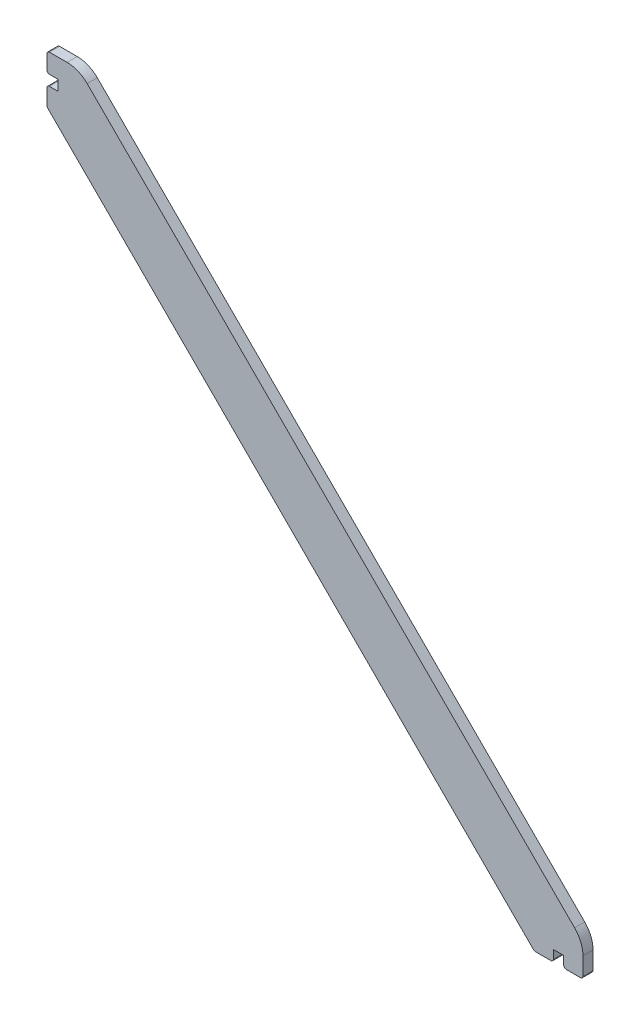
ISO-10303-21;
HEADER;
FILE_DESCRIPTION(('STEP AP214'),'2;1');
FILE_NAME('part.step','',(''),(''),'','','');
FILE_SCHEMA(('AUTOMOTIVE_DESIGN { 1 0 10303 214 1 1 1 1 }'));
ENDSEC;
DATA;
#1=APPLICATION_CONTEXT('core data for automotive mechanical design processes');
#2=APPLICATION_PROTOCOL_DEFINITION('international standard','automotive_design',2000,#1);
#3=PRODUCT_CONTEXT('',#1,'mechanical');
#4=PRODUCT('Part','Part','',(#3));
#5=PRODUCT_RELATED_PRODUCT_CATEGORY('part','',(#4));
#6=PRODUCT_DEFINITION_FORMATION('','',#4);
#7=PRODUCT_DEFINITION_CONTEXT('part definition',#1,'design');
#8=PRODUCT_DEFINITION('design','',#6,#7);
#9=PRODUCT_DEFINITION_SHAPE('','',#8);
#10=(LENGTH_UNIT() NAMED_UNIT(*) SI_UNIT(.MILLI.,.METRE.));
#11=(NAMED_UNIT(*) PLANE_ANGLE_UNIT() SI_UNIT($,.RADIAN.));
#12=(NAMED_UNIT(*) SI_UNIT($,.STERADIAN.) SOLID_ANGLE_UNIT());
#13=UNCERTAINTY_MEASURE_WITH_UNIT(LENGTH_MEASURE(1.E-05),#10,'distance_accuracy_value','');
#14=(GEOMETRIC_REPRESENTATION_CONTEXT(3) GLOBAL_UNCERTAINTY_ASSIGNED_CONTEXT((#13)) GLOBAL_UNIT_ASSIGNED_CONTEXT((#10,
#11,#12)) REPRESENTATION_CONTEXT('',''));
#15=CARTESIAN_POINT('',(0.,0.,0.));
#16=DIRECTION('',(0.,0.,1.));
#17=DIRECTION('',(1.,0.,0.));
#18=AXIS2_PLACEMENT_3D('',#15,#16,#17);
#19=CARTESIAN_POINT('',(-100.,100.,4.));
#20=DIRECTION('',(1.,0.,0.));
#21=DIRECTION('',(0.,0.,-1.));
#22=AXIS2_PLACEMENT_3D('',#19,#20,#21);
#23=PLANE('',#22);
#24=DIRECTION('',(0.,-1.,0.));
#25=VECTOR('',#24,1.);
#26=CARTESIAN_POINT('',(-100.,100.,0.));
#27=LINE('',#26,#25);
#28=CARTESIAN_POINT('',(-100.,100.,0.));
#29=VERTEX_POINT('',#28);
#30=CARTESIAN_POINT('',(-100.,95.8999999999999,0.));
#31=VERTEX_POINT('',#30);
#32=EDGE_CURVE('E225',#29,#31,#27,.T.);
#33=ORIENTED_EDGE('',*,*,#32,.T.);
#34=DIRECTION('',(0.,0.,-1.));
#35=VECTOR('',#34,1.);
#36=CARTESIAN_POINT('',(-100.,95.8999999999999,4.));
#37=LINE('',#36,#35);
#38=CARTESIAN_POINT('',(-100.,95.8999999999999,4.));
#39=VERTEX_POINT('',#38);
#40=EDGE_CURVE('E11',#39,#31,#37,.T.);
#41=ORIENTED_EDGE('',*,*,#40,.F.);
#42=DIRECTION('',(0.,-1.,0.));
#43=VECTOR('',#42,1.);
#44=CARTESIAN_POINT('',(-100.,100.,4.));
#45=LINE('',#44,#43);
#46=CARTESIAN_POINT('',(-100.,100.,4.));
#47=VERTEX_POINT('',#46);
#48=EDGE_CURVE('E273',#47,#39,#45,.T.);
#49=ORIENTED_EDGE('',*,*,#48,.F.);
#50=DIRECTION('',(0.,0.,-1.));
#51=VECTOR('',#50,1.);
#52=CARTESIAN_POINT('',(-100.,100.,4.));
#53=LINE('',#52,#51);
#54=EDGE_CURVE('E221',#47,#29,#53,.T.);
#55=ORIENTED_EDGE('',*,*,#54,.T.);
#56=EDGE_LOOP('',(#33,#41,#49,#55));
#57=FACE_BOUND('',#56,.T.);
#58=ADVANCED_FACE('F33',(#57),#23,.F.);
#59=CARTESIAN_POINT('',(-100.,95.8999999999999,4.));
#60=DIRECTION('',(0.,-1.,0.));
#61=DIRECTION('',(0.,0.,-1.));
#62=AXIS2_PLACEMENT_3D('',#59,#60,#61);
#63=PLANE('',#62);
#64=DIRECTION('',(-1.,0.,0.));
#65=VECTOR('',#64,1.);
#66=CARTESIAN_POINT('',(-100.,95.8999999999999,0.));
#67=LINE('',#66,#65);
#68=CARTESIAN_POINT('',(-103.304951288349,95.8999999999999,0.));
#69=VERTEX_POINT('',#68);
#70=EDGE_CURVE('E228',#31,#69,#67,.T.);
#71=ORIENTED_EDGE('',*,*,#70,.T.);
#72=DIRECTION('',(0.,0.,-1.));
#73=VECTOR('',#72,1.);
#74=CARTESIAN_POINT('',(-103.304951288349,95.8999999999999,4.));
#75=LINE('',#74,#73);
#76=CARTESIAN_POINT('',(-103.304951288349,95.8999999999999,4.));
#77=VERTEX_POINT('',#76);
#78=EDGE_CURVE('E41',#77,#69,#75,.T.);
#79=ORIENTED_EDGE('',*,*,#78,.F.);
#80=DIRECTION('',(-1.,0.,0.));
#81=VECTOR('',#80,1.);
#82=CARTESIAN_POINT('',(-100.,95.8999999999999,4.));
#83=LINE('',#82,#81);
#84=EDGE_CURVE('E140',#39,#77,#83,.T.);
#85=ORIENTED_EDGE('',*,*,#84,.F.);
#86=ORIENTED_EDGE('',*,*,#40,.T.);
#87=EDGE_LOOP('',(#71,#79,#85,#86));
#88=FACE_BOUND('',#87,.T.);
#89=ADVANCED_FACE('F410',(#88),#63,.F.);
#90=CARTESIAN_POINT('',(-103.304951288349,94.8999999999999,4.));
#91=DIRECTION('',(0.,0.,-1.));
#92=DIRECTION('',(-1.,0.,0.));
#93=AXIS2_PLACEMENT_3D('',#90,#91,#92);
#94=CYLINDRICAL_SURFACE('',#93,1.);
#95=CARTESIAN_POINT('',(-103.304951288349,94.8999999999999,0.));
#96=DIRECTION('',(0.,0.,1.));
#97=DIRECTION('',(1.,0.,0.));
#98=AXIS2_PLACEMENT_3D('',#95,#96,#97);
#99=CIRCLE('',#98,1.);
#100=CARTESIAN_POINT('',(-104.304951288349,94.8999999999999,0.));
#101=VERTEX_POINT('',#100);
#102=EDGE_CURVE('E230',#69,#101,#99,.T.);
#103=ORIENTED_EDGE('',*,*,#102,.T.);
#104=DIRECTION('',(0.,0.,-1.));
#105=VECTOR('',#104,1.);
#106=CARTESIAN_POINT('',(-104.304951288349,94.8999999999999,4.));
#107=LINE('',#106,#105);
#108=CARTESIAN_POINT('',(-104.304951288349,94.8999999999999,4.));
#109=VERTEX_POINT('',#108);
#110=EDGE_CURVE('E328',#109,#101,#107,.T.);
#111=ORIENTED_EDGE('',*,*,#110,.F.);
#112=CARTESIAN_POINT('',(-103.304951288349,94.8999999999999,4.));
#113=DIRECTION('',(0.,0.,1.));
#114=DIRECTION('',(1.,0.,0.));
#115=AXIS2_PLACEMENT_3D('',#112,#113,#114);
#116=CIRCLE('',#115,1.);
#117=EDGE_CURVE('E336',#77,#109,#116,.T.);
#118=ORIENTED_EDGE('',*,*,#117,.F.);
#119=ORIENTED_EDGE('',*,*,#78,.T.);
#120=EDGE_LOOP('',(#103,#111,#118,#119));
#121=FACE_BOUND('',#120,.T.);
#122=ADVANCED_FACE('F334',(#121),#94,.T.);
#123=CARTESIAN_POINT('',(-104.304951288349,94.8999999999999,4.));
#124=DIRECTION('',(1.,0.,0.));
#125=DIRECTION('',(0.,0.,-1.));
#126=AXIS2_PLACEMENT_3D('',#123,#124,#125);
#127=PLANE('',#126);
#128=DIRECTION('',(0.,-1.,0.));
#129=VECTOR('',#128,1.);
#130=CARTESIAN_POINT('',(-104.304951288349,94.8999999999999,0.));
#131=LINE('',#130,#129);
#132=CARTESIAN_POINT('',(-104.304951288349,88.8092622740246,0.));
#133=VERTEX_POINT('',#132);
#134=EDGE_CURVE('E232',#101,#133,#131,.T.);
#135=ORIENTED_EDGE('',*,*,#134,.T.);
#136=DIRECTION('',(0.,0.,-1.));
#137=VECTOR('',#136,1.);
#138=CARTESIAN_POINT('',(-104.304951288349,88.8092622740246,4.));
#139=LINE('',#138,#137);
#140=CARTESIAN_POINT('',(-104.304951288349,88.8092622740246,4.));
#141=VERTEX_POINT('',#140);
#142=EDGE_CURVE('E325',#141,#133,#139,.T.);
#143=ORIENTED_EDGE('',*,*,#142,.F.);
#144=DIRECTION('',(0.,-1.,0.));
#145=VECTOR('',#144,1.);
#146=CARTESIAN_POINT('',(-104.304951288349,94.8999999999999,4.));
#147=LINE('',#146,#145);
#148=EDGE_CURVE('E353',#109,#141,#147,.T.);
#149=ORIENTED_EDGE('',*,*,#148,.F.);
#150=ORIENTED_EDGE('',*,*,#110,.T.);
#151=EDGE_LOOP('',(#135,#143,#149,#150));
#152=FACE_BOUND('',#151,.T.);
#153=ADVANCED_FACE('F344',(#152),#127,.F.);
#154=CARTESIAN_POINT('',(-103.304951288349,88.8092622740246,4.));
#155=DIRECTION('',(0.,0.,-1.));
#156=DIRECTION('',(-1.,0.,0.));
#157=AXIS2_PLACEMENT_3D('',#154,#155,#156);
#158=CYLINDRICAL_SURFACE('',#157,1.00000000000006);
#159=CARTESIAN_POINT('',(-103.304951288349,88.8092622740246,0.));
#160=DIRECTION('',(0.,0.,1.));
#161=DIRECTION('',(1.,0.,0.));
#162=AXIS2_PLACEMENT_3D('',#159,#160,#161);
#163=CIRCLE('',#162,1.00000000000006);
#164=CARTESIAN_POINT('',(-104.012058069535,88.102155492838,0.));
#165=VERTEX_POINT('',#164);
#166=EDGE_CURVE('E234',#133,#165,#163,.T.);
#167=ORIENTED_EDGE('',*,*,#166,.T.);
#168=DIRECTION('',(0.,0.,-1.));
#169=VECTOR('',#168,1.);
#170=CARTESIAN_POINT('',(-104.012058069535,88.102155492838,4.));
#171=LINE('',#170,#169);
#172=CARTESIAN_POINT('',(-104.012058069535,88.102155492838,4.));
#173=VERTEX_POINT('',#172);
#174=EDGE_CURVE('E322',#173,#165,#171,.T.);
#175=ORIENTED_EDGE('',*,*,#174,.F.);
#176=CARTESIAN_POINT('',(-103.304951288349,88.8092622740246,4.));
#177=DIRECTION('',(0.,0.,1.));
#178=DIRECTION('',(1.,0.,0.));
#179=AXIS2_PLACEMENT_3D('',#176,#177,#178);
#180=CIRCLE('',#179,1.00000000000006);
#181=EDGE_CURVE('E350',#141,#173,#180,.T.);
#182=ORIENTED_EDGE('',*,*,#181,.F.);
#183=ORIENTED_EDGE('',*,*,#142,.T.);
#184=EDGE_LOOP('',(#167,#175,#182,#183));
#185=FACE_BOUND('',#184,.T.);
#186=ADVANCED_FACE('F348',(#185),#158,.T.);
#187=CARTESIAN_POINT('',(88.1021554928379,-104.012058069535,4.));
#188=DIRECTION('',(0.707106781186557,0.707106781186538,0.));
#189=DIRECTION('',(-0.707106781186538,0.707106781186557,0.));
#190=AXIS2_PLACEMENT_3D('',#187,#188,#189);
#191=PLANE('',#190);
#192=DIRECTION('',(0.707106781186538,-0.707106781186557,0.));
#193=VECTOR('',#192,1.);
#194=CARTESIAN_POINT('',(88.1021554928379,-104.012058069535,0.));
#195=LINE('',#194,#193);
#196=CARTESIAN_POINT('',(88.1021554928379,-104.012058069535,0.));
#197=VERTEX_POINT('',#196);
#198=EDGE_CURVE('E237',#165,#197,#195,.T.);
#199=ORIENTED_EDGE('',*,*,#198,.T.);
#200=DIRECTION('',(0.,0.,-1.));
#201=VECTOR('',#200,1.);
#202=CARTESIAN_POINT('',(88.1021554928379,-104.012058069535,4.));
#203=LINE('',#202,#201);
#204=CARTESIAN_POINT('',(88.1021554928379,-104.012058069535,4.));
#205=VERTEX_POINT('',#204);
#206=EDGE_CURVE('E319',#205,#197,#203,.T.);
#207=ORIENTED_EDGE('',*,*,#206,.F.);
#208=DIRECTION('',(0.707106781186557,-0.707106781186538,0.));
#209=VECTOR('',#208,1.);
#210=CARTESIAN_POINT('',(-104.012058069535,88.102155492838,4.));
#211=LINE('',#210,#209);
#212=EDGE_CURVE('E352',#173,#205,#211,.T.);
#213=ORIENTED_EDGE('',*,*,#212,.F.);
#214=ORIENTED_EDGE('',*,*,#174,.T.);
#215=EDGE_LOOP('',(#199,#207,#213,#214));
#216=FACE_BOUND('',#215,.T.);
#217=ADVANCED_FACE('F423',(#216),#191,.F.);
#218=CARTESIAN_POINT('',(88.8092622740244,-103.304951288348,4.));
#219=DIRECTION('',(0.,0.,-1.));
#220=DIRECTION('',(-1.,0.,0.));
#221=AXIS2_PLACEMENT_3D('',#218,#219,#220);
#222=CYLINDRICAL_SURFACE('',#221,1.00000000000011);
#223=CARTESIAN_POINT('',(88.8092622740244,-103.304951288348,0.));
#224=DIRECTION('',(0.,0.,1.));
#225=DIRECTION('',(-1.,0.,0.));
#226=AXIS2_PLACEMENT_3D('',#223,#224,#225);
#227=CIRCLE('',#226,1.00000000000011);
#228=CARTESIAN_POINT('',(88.8092622740245,-104.304951288349,0.));
#229=VERTEX_POINT('',#228);
#230=EDGE_CURVE('E239',#197,#229,#227,.T.);
#231=ORIENTED_EDGE('',*,*,#230,.T.);
#232=DIRECTION('',(0.,0.,-1.));
#233=VECTOR('',#232,1.);
#234=CARTESIAN_POINT('',(88.8092622740245,-104.304951288349,4.));
#235=LINE('',#234,#233);
#236=CARTESIAN_POINT('',(88.8092622740245,-104.304951288349,4.));
#237=VERTEX_POINT('',#236);
#238=EDGE_CURVE('E316',#237,#229,#235,.T.);
#239=ORIENTED_EDGE('',*,*,#238,.F.);
#240=CARTESIAN_POINT('',(88.8092622740244,-103.304951288348,4.));
#241=DIRECTION('',(0.,0.,1.));
#242=DIRECTION('',(-1.,0.,0.));
#243=AXIS2_PLACEMENT_3D('',#240,#241,#242);
#244=CIRCLE('',#243,1.00000000000011);
#245=EDGE_CURVE('E355',#205,#237,#244,.T.);
#246=ORIENTED_EDGE('',*,*,#245,.F.);
#247=ORIENTED_EDGE('',*,*,#206,.T.);
#248=EDGE_LOOP('',(#231,#239,#246,#247));
#249=FACE_BOUND('',#248,.T.);
#250=ADVANCED_FACE('F426',(#249),#222,.T.);
#251=CARTESIAN_POINT('',(94.8999999999999,-104.304951288349,4.));
#252=DIRECTION('',(0.,1.,0.));
#253=DIRECTION('',(0.,0.,1.));
#254=AXIS2_PLACEMENT_3D('',#251,#252,#253);
#255=PLANE('',#254);
#256=DIRECTION('',(1.,0.,0.));
#257=VECTOR('',#256,1.);
#258=CARTESIAN_POINT('',(94.8999999999999,-104.304951288349,0.));
#259=LINE('',#258,#257);
#260=CARTESIAN_POINT('',(94.8999999999999,-104.304951288349,0.));
#261=VERTEX_POINT('',#260);
#262=EDGE_CURVE('E241',#229,#261,#259,.T.);
#263=ORIENTED_EDGE('',*,*,#262,.T.);
#264=DIRECTION('',(0.,0.,-1.));
#265=VECTOR('',#264,1.);
#266=CARTESIAN_POINT('',(94.8999999999999,-104.304951288349,4.));
#267=LINE('',#266,#265);
#268=CARTESIAN_POINT('',(94.8999999999999,-104.304951288349,4.));
#269=VERTEX_POINT('',#268);
#270=EDGE_CURVE('E313',#269,#261,#267,.T.);
#271=ORIENTED_EDGE('',*,*,#270,.F.);
#272=DIRECTION('',(1.,0.,0.));
#273=VECTOR('',#272,1.);
#274=CARTESIAN_POINT('',(94.8999999999999,-104.304951288349,4.));
#275=LINE('',#274,#273);
#276=EDGE_CURVE('E361',#237,#269,#275,.T.);
#277=ORIENTED_EDGE('',*,*,#276,.F.);
#278=ORIENTED_EDGE('',*,*,#238,.T.);
#279=EDGE_LOOP('',(#263,#271,#277,#278));
#280=FACE_BOUND('',#279,.T.);
#281=ADVANCED_FACE('F430',(#280),#255,.F.);
#282=CARTESIAN_POINT('',(94.8999999999999,-103.304951288349,4.));
#283=DIRECTION('',(0.,0.,-1.));
#284=DIRECTION('',(-1.,0.,0.));
#285=AXIS2_PLACEMENT_3D('',#282,#283,#284);
#286=CYLINDRICAL_SURFACE('',#285,1.00000000000006);
#287=CARTESIAN_POINT('',(94.8999999999999,-103.304951288349,0.));
#288=DIRECTION('',(0.,0.,1.));
#289=DIRECTION('',(-1.,0.,0.));
#290=AXIS2_PLACEMENT_3D('',#287,#288,#289);
#291=CIRCLE('',#290,1.00000000000006);
#292=CARTESIAN_POINT('',(95.9,-103.304951288349,0.));
#293=VERTEX_POINT('',#292);
#294=EDGE_CURVE('E243',#261,#293,#291,.T.);
#295=ORIENTED_EDGE('',*,*,#294,.T.);
#296=DIRECTION('',(0.,0.,-1.));
#297=VECTOR('',#296,1.);
#298=CARTESIAN_POINT('',(95.9,-103.304951288349,4.));
#299=LINE('',#298,#297);
#300=CARTESIAN_POINT('',(95.9,-103.304951288349,4.));
#301=VERTEX_POINT('',#300);
#302=EDGE_CURVE('E310',#301,#293,#299,.T.);
#303=ORIENTED_EDGE('',*,*,#302,.F.);
#304=CARTESIAN_POINT('',(94.8999999999999,-103.304951288349,4.));
#305=DIRECTION('',(0.,0.,1.));
#306=DIRECTION('',(-1.,0.,0.));
#307=AXIS2_PLACEMENT_3D('',#304,#305,#306);
#308=CIRCLE('',#307,1.00000000000006);
#309=EDGE_CURVE('E363',#269,#301,#308,.T.);
#310=ORIENTED_EDGE('',*,*,#309,.F.);
#311=ORIENTED_EDGE('',*,*,#270,.T.);
#312=EDGE_LOOP('',(#295,#303,#310,#311));
#313=FACE_BOUND('',#312,.T.);
#314=ADVANCED_FACE('F434',(#313),#286,.T.);
#315=CARTESIAN_POINT('',(95.9,-100.,4.));
#316=DIRECTION('',(-1.,0.,0.));
#317=DIRECTION('',(0.,0.,1.));
#318=AXIS2_PLACEMENT_3D('',#315,#316,#317);
#319=PLANE('',#318);
#320=DIRECTION('',(0.,1.,0.));
#321=VECTOR('',#320,1.);
#322=CARTESIAN_POINT('',(95.9,-100.,0.));
#323=LINE('',#322,#321);
#324=CARTESIAN_POINT('',(95.9,-100.,0.));
#325=VERTEX_POINT('',#324);
#326=EDGE_CURVE('E245',#293,#325,#323,.T.);
#327=ORIENTED_EDGE('',*,*,#326,.T.);
#328=DIRECTION('',(0.,0.,-1.));
#329=VECTOR('',#328,1.);
#330=CARTESIAN_POINT('',(95.9,-100.,4.));
#331=LINE('',#330,#329);
#332=CARTESIAN_POINT('',(95.9,-100.,4.));
#333=VERTEX_POINT('',#332);
#334=EDGE_CURVE('E307',#333,#325,#331,.T.);
#335=ORIENTED_EDGE('',*,*,#334,.F.);
#336=DIRECTION('',(0.,1.,0.));
#337=VECTOR('',#336,1.);
#338=CARTESIAN_POINT('',(95.9,-100.,4.));
#339=LINE('',#338,#337);
#340=EDGE_CURVE('E365',#301,#333,#339,.T.);
#341=ORIENTED_EDGE('',*,*,#340,.F.);
#342=ORIENTED_EDGE('',*,*,#302,.T.);
#343=EDGE_LOOP('',(#327,#335,#341,#342));
#344=FACE_BOUND('',#343,.T.);
#345=ADVANCED_FACE('F438',(#344),#319,.F.);
#346=CARTESIAN_POINT('',(99.9999999999999,-99.9999999999999,4.));
#347=DIRECTION('',(0.,1.,0.));
#348=DIRECTION('',(-1.,0.,0.));
#349=AXIS2_PLACEMENT_3D('',#346,#347,#348);
#350=PLANE('',#349);
#351=DIRECTION('',(1.,0.,0.));
#352=VECTOR('',#351,1.);
#353=CARTESIAN_POINT('',(99.9999999999999,-99.9999999999999,0.));
#354=LINE('',#353,#352);
#355=CARTESIAN_POINT('',(99.9999999999999,-99.9999999999999,0.));
#356=VERTEX_POINT('',#355);
#357=EDGE_CURVE('E247',#325,#356,#354,.T.);
#358=ORIENTED_EDGE('',*,*,#357,.T.);
#359=DIRECTION('',(0.,0.,-1.));
#360=VECTOR('',#359,1.);
#361=CARTESIAN_POINT('',(99.9999999999999,-99.9999999999999,4.));
#362=LINE('',#361,#360);
#363=CARTESIAN_POINT('',(99.9999999999999,-99.9999999999999,4.));
#364=VERTEX_POINT('',#363);
#365=EDGE_CURVE('E304',#364,#356,#362,.T.);
#366=ORIENTED_EDGE('',*,*,#365,.F.);
#367=DIRECTION('',(1.,0.,0.));
#368=VECTOR('',#367,1.);
#369=CARTESIAN_POINT('',(99.9999999999999,-99.9999999999999,4.));
#370=LINE('',#369,#368);
#371=EDGE_CURVE('E367',#333,#364,#370,.T.);
#372=ORIENTED_EDGE('',*,*,#371,.F.);
#373=ORIENTED_EDGE('',*,*,#334,.T.);
#374=EDGE_LOOP('',(#358,#366,#372,#373));
#375=FACE_BOUND('',#374,.T.);
#376=ADVANCED_FACE('F442',(#375),#350,.F.);
#377=CARTESIAN_POINT('',(100.,-103.304951288349,4.));
#378=DIRECTION('',(1.,0.,0.));
#379=DIRECTION('',(0.,1.,0.));
#380=AXIS2_PLACEMENT_3D('',#377,#378,#379);
#381=PLANE('',#380);
#382=DIRECTION('',(0.,-1.,0.));
#383=VECTOR('',#382,1.);
#384=CARTESIAN_POINT('',(100.,-103.304951288349,0.));
#385=LINE('',#384,#383);
#386=CARTESIAN_POINT('',(99.9999999999999,-103.304951288349,0.));
#387=VERTEX_POINT('',#386);
#388=EDGE_CURVE('E249',#356,#387,#385,.T.);
#389=ORIENTED_EDGE('',*,*,#388,.T.);
#390=DIRECTION('',(0.,0.,-1.));
#391=VECTOR('',#390,1.);
#392=CARTESIAN_POINT('',(99.9999999999999,-103.304951288349,4.));
#393=LINE('',#392,#391);
#394=CARTESIAN_POINT('',(99.9999999999999,-103.304951288349,4.));
#395=VERTEX_POINT('',#394);
#396=EDGE_CURVE('E301',#395,#387,#393,.T.);
#397=ORIENTED_EDGE('',*,*,#396,.F.);
#398=DIRECTION('',(0.,-1.,0.));
#399=VECTOR('',#398,1.);
#400=CARTESIAN_POINT('',(100.,-103.304951288349,4.));
#401=LINE('',#400,#399);
#402=EDGE_CURVE('E369',#364,#395,#401,.T.);
#403=ORIENTED_EDGE('',*,*,#402,.F.);
#404=ORIENTED_EDGE('',*,*,#365,.T.);
#405=EDGE_LOOP('',(#389,#397,#403,#404));
#406=FACE_BOUND('',#405,.T.);
#407=ADVANCED_FACE('F446',(#406),#381,.F.);
#408=CARTESIAN_POINT('',(101.,-103.304951288349,4.));
#409=DIRECTION('',(0.,0.,-1.));
#410=DIRECTION('',(-1.,0.,0.));
#411=AXIS2_PLACEMENT_3D('',#408,#409,#410);
#412=CYLINDRICAL_SURFACE('',#411,0.999999999999945);
#413=CARTESIAN_POINT('',(101.,-103.304951288349,0.));
#414=DIRECTION('',(0.,0.,1.));
#415=DIRECTION('',(-1.,0.,0.));
#416=AXIS2_PLACEMENT_3D('',#413,#414,#415);
#417=CIRCLE('',#416,0.999999999999945);
#418=CARTESIAN_POINT('',(101.,-104.304951288349,0.));
#419=VERTEX_POINT('',#418);
#420=EDGE_CURVE('E251',#387,#419,#417,.T.);
#421=ORIENTED_EDGE('',*,*,#420,.T.);
#422=DIRECTION('',(0.,0.,-1.));
#423=VECTOR('',#422,1.);
#424=CARTESIAN_POINT('',(101.,-104.304951288349,4.));
#425=LINE('',#424,#423);
#426=CARTESIAN_POINT('',(101.,-104.304951288349,4.));
#427=VERTEX_POINT('',#426);
#428=EDGE_CURVE('E298',#427,#419,#425,.T.);
#429=ORIENTED_EDGE('',*,*,#428,.F.);
#430=CARTESIAN_POINT('',(101.,-103.304951288349,4.));
#431=DIRECTION('',(0.,0.,1.));
#432=DIRECTION('',(-1.,0.,0.));
#433=AXIS2_PLACEMENT_3D('',#430,#431,#432);
#434=CIRCLE('',#433,0.999999999999945);
#435=EDGE_CURVE('E371',#395,#427,#434,.T.);
#436=ORIENTED_EDGE('',*,*,#435,.F.);
#437=ORIENTED_EDGE('',*,*,#396,.T.);
#438=EDGE_LOOP('',(#421,#429,#436,#437));
#439=FACE_BOUND('',#438,.T.);
#440=ADVANCED_FACE('F450',(#439),#412,.T.);
#441=CARTESIAN_POINT('',(106.6,-104.304951288349,4.));
#442=DIRECTION('',(0.,1.,0.));
#443=DIRECTION('',(0.,0.,1.));
#444=AXIS2_PLACEMENT_3D('',#441,#442,#443);
#445=PLANE('',#444);
#446=DIRECTION('',(1.,0.,0.));
#447=VECTOR('',#446,1.);
#448=CARTESIAN_POINT('',(106.6,-104.304951288349,0.));
#449=LINE('',#448,#447);
#450=CARTESIAN_POINT('',(106.6,-104.304951288349,0.));
#451=VERTEX_POINT('',#450);
#452=EDGE_CURVE('E253',#419,#451,#449,.T.);
#453=ORIENTED_EDGE('',*,*,#452,.T.);
#454=DIRECTION('',(0.,0.,-1.));
#455=VECTOR('',#454,1.);
#456=CARTESIAN_POINT('',(106.6,-104.304951288349,4.));
#457=LINE('',#456,#455);
#458=CARTESIAN_POINT('',(106.6,-104.304951288349,4.));
#459=VERTEX_POINT('',#458);
#460=EDGE_CURVE('E295',#459,#451,#457,.T.);
#461=ORIENTED_EDGE('',*,*,#460,.F.);
#462=DIRECTION('',(1.,0.,0.));
#463=VECTOR('',#462,1.);
#464=CARTESIAN_POINT('',(106.6,-104.304951288349,4.));
#465=LINE('',#464,#463);
#466=EDGE_CURVE('E373',#427,#459,#465,.T.);
#467=ORIENTED_EDGE('',*,*,#466,.F.);
#468=ORIENTED_EDGE('',*,*,#428,.T.);
#469=EDGE_LOOP('',(#453,#461,#467,#468));
#470=FACE_BOUND('',#469,.T.);
#471=ADVANCED_FACE('F454',(#470),#445,.F.);
#472=CARTESIAN_POINT('',(106.6,-103.304951288349,4.));
#473=DIRECTION('',(0.,0.,-1.));
#474=DIRECTION('',(-1.,0.,0.));
#475=AXIS2_PLACEMENT_3D('',#472,#473,#474);
#476=CYLINDRICAL_SURFACE('',#475,1.00000000000008);
#477=CARTESIAN_POINT('',(106.6,-103.304951288349,0.));
#478=DIRECTION('',(0.,0.,1.));
#479=DIRECTION('',(-1.,0.,0.));
#480=AXIS2_PLACEMENT_3D('',#477,#478,#479);
#481=CIRCLE('',#480,1.00000000000008);
#482=CARTESIAN_POINT('',(107.6,-103.304951288349,0.));
#483=VERTEX_POINT('',#482);
#484=EDGE_CURVE('E255',#451,#483,#481,.T.);
#485=ORIENTED_EDGE('',*,*,#484,.T.);
#486=DIRECTION('',(0.,0.,-1.));
#487=VECTOR('',#486,1.);
#488=CARTESIAN_POINT('',(107.6,-103.304951288349,4.));
#489=LINE('',#488,#487);
#490=CARTESIAN_POINT('',(107.6,-103.304951288349,4.));
#491=VERTEX_POINT('',#490);
#492=EDGE_CURVE('E292',#491,#483,#489,.T.);
#493=ORIENTED_EDGE('',*,*,#492,.F.);
#494=CARTESIAN_POINT('',(106.6,-103.304951288349,4.));
#495=DIRECTION('',(0.,0.,1.));
#496=DIRECTION('',(-1.,0.,0.));
#497=AXIS2_PLACEMENT_3D('',#494,#495,#496);
#498=CIRCLE('',#497,1.00000000000008);
#499=EDGE_CURVE('E375',#459,#491,#498,.T.);
#500=ORIENTED_EDGE('',*,*,#499,.F.);
#501=ORIENTED_EDGE('',*,*,#460,.T.);
#502=EDGE_LOOP('',(#485,#493,#500,#501));
#503=FACE_BOUND('',#502,.T.);
#504=ADVANCED_FACE('F458',(#503),#476,.T.);
#505=CARTESIAN_POINT('',(107.6,-96.3499999999999,4.));
#506=DIRECTION('',(-1.,0.,0.));
#507=DIRECTION('',(0.,-1.,0.));
#508=AXIS2_PLACEMENT_3D('',#505,#506,#507);
#509=PLANE('',#508);
#510=DIRECTION('',(0.,1.,0.));
#511=VECTOR('',#510,1.);
#512=CARTESIAN_POINT('',(107.6,-96.3499999999999,0.));
#513=LINE('',#512,#511);
#514=CARTESIAN_POINT('',(107.6,-96.3499999999999,0.));
#515=VERTEX_POINT('',#514);
#516=EDGE_CURVE('E257',#483,#515,#513,.T.);
#517=ORIENTED_EDGE('',*,*,#516,.T.);
#518=DIRECTION('',(0.,0.,-1.));
#519=VECTOR('',#518,1.);
#520=CARTESIAN_POINT('',(107.6,-96.3499999999999,4.));
#521=LINE('',#520,#519);
#522=CARTESIAN_POINT('',(107.6,-96.3499999999999,4.));
#523=VERTEX_POINT('',#522);
#524=EDGE_CURVE('E289',#523,#515,#521,.T.);
#525=ORIENTED_EDGE('',*,*,#524,.F.);
#526=DIRECTION('',(0.,1.,0.));
#527=VECTOR('',#526,1.);
#528=CARTESIAN_POINT('',(107.6,-96.3499999999999,4.));
#529=LINE('',#528,#527);
#530=EDGE_CURVE('E377',#491,#523,#529,.T.);
#531=ORIENTED_EDGE('',*,*,#530,.F.);
#532=ORIENTED_EDGE('',*,*,#492,.T.);
#533=EDGE_LOOP('',(#517,#525,#531,#532));
#534=FACE_BOUND('',#533,.T.);
#535=ADVANCED_FACE('F462',(#534),#509,.F.);
#536=CARTESIAN_POINT('',(96.3500000000001,-96.3500000000001,4.));
#537=DIRECTION('',(0.,0.,-1.));
#538=DIRECTION('',(-1.,0.,0.));
#539=AXIS2_PLACEMENT_3D('',#536,#537,#538);
#540=CYLINDRICAL_SURFACE('',#539,11.2499999999999);
#541=CARTESIAN_POINT('',(96.3500000000001,-96.3500000000001,0.));
#542=DIRECTION('',(0.,0.,1.));
#543=DIRECTION('',(-1.,0.,0.));
#544=AXIS2_PLACEMENT_3D('',#541,#542,#543);
#545=CIRCLE('',#544,11.2499999999999);
#546=CARTESIAN_POINT('',(104.304951288348,-88.3950487116512,0.));
#547=VERTEX_POINT('',#546);
#548=EDGE_CURVE('E259',#515,#547,#545,.T.);
#549=ORIENTED_EDGE('',*,*,#548,.T.);
#550=DIRECTION('',(0.,0.,-1.));
#551=VECTOR('',#550,1.);
#552=CARTESIAN_POINT('',(104.304951288348,-88.3950487116512,4.));
#553=LINE('',#552,#551);
#554=CARTESIAN_POINT('',(104.304951288348,-88.3950487116512,4.));
#555=VERTEX_POINT('',#554);
#556=EDGE_CURVE('E286',#555,#547,#553,.T.);
#557=ORIENTED_EDGE('',*,*,#556,.F.);
#558=CARTESIAN_POINT('',(96.3500000000001,-96.3500000000001,4.));
#559=DIRECTION('',(0.,0.,1.));
#560=DIRECTION('',(-1.,0.,0.));
#561=AXIS2_PLACEMENT_3D('',#558,#559,#560);
#562=CIRCLE('',#561,11.2499999999999);
#563=EDGE_CURVE('E379',#523,#555,#562,.T.);
#564=ORIENTED_EDGE('',*,*,#563,.F.);
#565=ORIENTED_EDGE('',*,*,#524,.T.);
#566=EDGE_LOOP('',(#549,#557,#564,#565));
#567=FACE_BOUND('',#566,.T.);
#568=ADVANCED_FACE('F466',(#567),#540,.T.);
#569=CARTESIAN_POINT('',(-88.3950487116513,104.304951288349,4.));
#570=DIRECTION('',(-0.707106781186538,-0.707106781186557,0.));
#571=DIRECTION('',(0.707106781186557,-0.707106781186538,0.));
#572=AXIS2_PLACEMENT_3D('',#569,#570,#571);
#573=PLANE('',#572);
#574=DIRECTION('',(-0.707106781186557,0.707106781186538,0.));
#575=VECTOR('',#574,1.);
#576=CARTESIAN_POINT('',(-88.3950487116513,104.304951288349,0.));
#577=LINE('',#576,#575);
#578=CARTESIAN_POINT('',(-88.3950487116513,104.304951288349,0.));
#579=VERTEX_POINT('',#578);
#580=EDGE_CURVE('E262',#547,#579,#577,.T.);
#581=ORIENTED_EDGE('',*,*,#580,.T.);
#582=DIRECTION('',(0.,0.,-1.));
#583=VECTOR('',#582,1.);
#584=CARTESIAN_POINT('',(-88.3950487116513,104.304951288349,4.));
#585=LINE('',#584,#583);
#586=CARTESIAN_POINT('',(-88.3950487116513,104.304951288349,4.));
#587=VERTEX_POINT('',#586);
#588=EDGE_CURVE('E283',#587,#579,#585,.T.);
#589=ORIENTED_EDGE('',*,*,#588,.F.);
#590=DIRECTION('',(-0.707106781186538,0.707106781186557,0.));
#591=VECTOR('',#590,1.);
#592=CARTESIAN_POINT('',(104.304951288348,-88.3950487116512,4.));
#593=LINE('',#592,#591);
#594=EDGE_CURVE('E381',#555,#587,#593,.T.);
#595=ORIENTED_EDGE('',*,*,#594,.F.);
#596=ORIENTED_EDGE('',*,*,#556,.T.);
#597=EDGE_LOOP('',(#581,#589,#595,#596));
#598=FACE_BOUND('',#597,.T.);
#599=ADVANCED_FACE('F470',(#598),#573,.F.);
#600=CARTESIAN_POINT('',(-96.35,96.35,4.));
#601=DIRECTION('',(0.,0.,-1.));
#602=DIRECTION('',(-1.,0.,0.));
#603=AXIS2_PLACEMENT_3D('',#600,#601,#602);
#604=CYLINDRICAL_SURFACE('',#603,11.25);
#605=CARTESIAN_POINT('',(-96.35,96.35,0.));
#606=DIRECTION('',(0.,0.,1.));
#607=DIRECTION('',(1.,0.,0.));
#608=AXIS2_PLACEMENT_3D('',#605,#606,#607);
#609=CIRCLE('',#608,11.25);
#610=CARTESIAN_POINT('',(-96.35,107.6,0.));
#611=VERTEX_POINT('',#610);
#612=EDGE_CURVE('E264',#579,#611,#609,.T.);
#613=ORIENTED_EDGE('',*,*,#612,.T.);
#614=DIRECTION('',(0.,0.,-1.));
#615=VECTOR('',#614,1.);
#616=CARTESIAN_POINT('',(-96.35,107.6,4.));
#617=LINE('',#616,#615);
#618=CARTESIAN_POINT('',(-96.35,107.6,4.));
#619=VERTEX_POINT('',#618);
#620=EDGE_CURVE('E280',#619,#611,#617,.T.);
#621=ORIENTED_EDGE('',*,*,#620,.F.);
#622=CARTESIAN_POINT('',(-96.35,96.35,4.));
#623=DIRECTION('',(0.,0.,1.));
#624=DIRECTION('',(1.,0.,0.));
#625=AXIS2_PLACEMENT_3D('',#622,#623,#624);
#626=CIRCLE('',#625,11.25);
#627=EDGE_CURVE('E383',#587,#619,#626,.T.);
#628=ORIENTED_EDGE('',*,*,#627,.F.);
#629=ORIENTED_EDGE('',*,*,#588,.T.);
#630=EDGE_LOOP('',(#613,#621,#628,#629));
#631=FACE_BOUND('',#630,.T.);
#632=ADVANCED_FACE('F474',(#631),#604,.T.);
#633=CARTESIAN_POINT('',(-96.35,107.6,4.));
#634=DIRECTION('',(0.,-1.,0.));
#635=DIRECTION('',(0.,0.,-1.));
#636=AXIS2_PLACEMENT_3D('',#633,#634,#635);
#637=PLANE('',#636);
#638=DIRECTION('',(-1.,0.,0.));
#639=VECTOR('',#638,1.);
#640=CARTESIAN_POINT('',(-96.35,107.6,0.));
#641=LINE('',#640,#639);
#642=CARTESIAN_POINT('',(-103.304951288349,107.6,0.));
#643=VERTEX_POINT('',#642);
#644=EDGE_CURVE('E266',#611,#643,#641,.T.);
#645=ORIENTED_EDGE('',*,*,#644,.T.);
#646=DIRECTION('',(0.,0.,-1.));
#647=VECTOR('',#646,1.);
#648=CARTESIAN_POINT('',(-103.304951288349,107.6,4.));
#649=LINE('',#648,#647);
#650=CARTESIAN_POINT('',(-103.304951288349,107.6,4.));
#651=VERTEX_POINT('',#650);
#652=EDGE_CURVE('E277',#651,#643,#649,.T.);
#653=ORIENTED_EDGE('',*,*,#652,.F.);
#654=DIRECTION('',(-1.,0.,0.));
#655=VECTOR('',#654,1.);
#656=CARTESIAN_POINT('',(-96.35,107.6,4.));
#657=LINE('',#656,#655);
#658=EDGE_CURVE('E385',#619,#651,#657,.T.);
#659=ORIENTED_EDGE('',*,*,#658,.F.);
#660=ORIENTED_EDGE('',*,*,#620,.T.);
#661=EDGE_LOOP('',(#645,#653,#659,#660));
#662=FACE_BOUND('',#661,.T.);
#663=ADVANCED_FACE('F391',(#662),#637,.F.);
#664=CARTESIAN_POINT('',(-103.304951288349,106.6,4.));
#665=DIRECTION('',(0.,0.,-1.));
#666=DIRECTION('',(-1.,0.,0.));
#667=AXIS2_PLACEMENT_3D('',#664,#665,#666);
#668=CYLINDRICAL_SURFACE('',#667,1.);
#669=CARTESIAN_POINT('',(-103.304951288349,106.6,0.));
#670=DIRECTION('',(0.,0.,1.));
#671=DIRECTION('',(1.,0.,0.));
#672=AXIS2_PLACEMENT_3D('',#669,#670,#671);
#673=CIRCLE('',#672,1.);
#674=CARTESIAN_POINT('',(-104.304951288349,106.6,0.));
#675=VERTEX_POINT('',#674);
#676=EDGE_CURVE('E268',#643,#675,#673,.T.);
#677=ORIENTED_EDGE('',*,*,#676,.T.);
#678=DIRECTION('',(0.,0.,-1.));
#679=VECTOR('',#678,1.);
#680=CARTESIAN_POINT('',(-104.304951288349,106.6,4.));
#681=LINE('',#680,#679);
#682=CARTESIAN_POINT('',(-104.304951288349,106.6,4.));
#683=VERTEX_POINT('',#682);
#684=EDGE_CURVE('E216',#683,#675,#681,.T.);
#685=ORIENTED_EDGE('',*,*,#684,.F.);
#686=CARTESIAN_POINT('',(-103.304951288349,106.6,4.));
#687=DIRECTION('',(0.,0.,1.));
#688=DIRECTION('',(1.,0.,0.));
#689=AXIS2_PLACEMENT_3D('',#686,#687,#688);
#690=CIRCLE('',#689,1.);
#691=EDGE_CURVE('E207',#651,#683,#690,.T.);
#692=ORIENTED_EDGE('',*,*,#691,.F.);
#693=ORIENTED_EDGE('',*,*,#652,.T.);
#694=EDGE_LOOP('',(#677,#685,#692,#693));
#695=FACE_BOUND('',#694,.T.);
#696=ADVANCED_FACE('F395',(#695),#668,.T.);
#697=CARTESIAN_POINT('',(-104.304951288349,106.6,4.));
#698=DIRECTION('',(1.,0.,0.));
#699=DIRECTION('',(0.,0.,-1.));
#700=AXIS2_PLACEMENT_3D('',#697,#698,#699);
#701=PLANE('',#700);
#702=DIRECTION('',(0.,-1.,0.));
#703=VECTOR('',#702,1.);
#704=CARTESIAN_POINT('',(-104.304951288349,106.6,0.));
#705=LINE('',#704,#703);
#706=CARTESIAN_POINT('',(-104.304951288349,101.,0.));
#707=VERTEX_POINT('',#706);
#708=EDGE_CURVE('E215',#675,#707,#705,.T.);
#709=ORIENTED_EDGE('',*,*,#708,.T.);
#710=DIRECTION('',(0.,0.,-1.));
#711=VECTOR('',#710,1.);
#712=CARTESIAN_POINT('',(-104.304951288349,101.,4.));
#713=LINE('',#712,#711);
#714=CARTESIAN_POINT('',(-104.304951288349,101.,4.));
#715=VERTEX_POINT('',#714);
#716=EDGE_CURVE('E212',#715,#707,#713,.T.);
#717=ORIENTED_EDGE('',*,*,#716,.F.);
#718=DIRECTION('',(0.,-1.,0.));
#719=VECTOR('',#718,1.);
#720=CARTESIAN_POINT('',(-104.304951288349,106.6,4.));
#721=LINE('',#720,#719);
#722=EDGE_CURVE('E201',#683,#715,#721,.T.);
#723=ORIENTED_EDGE('',*,*,#722,.F.);
#724=ORIENTED_EDGE('',*,*,#684,.T.);
#725=EDGE_LOOP('',(#709,#717,#723,#724));
#726=FACE_BOUND('',#725,.T.);
#727=ADVANCED_FACE('F213',(#726),#701,.F.);
#728=CARTESIAN_POINT('',(-103.304951288349,101.,4.));
#729=DIRECTION('',(0.,0.,-1.));
#730=DIRECTION('',(-1.,0.,0.));
#731=AXIS2_PLACEMENT_3D('',#728,#729,#730);
#732=CYLINDRICAL_SURFACE('',#731,1.);
#733=CARTESIAN_POINT('',(-103.304951288349,101.,0.));
#734=DIRECTION('',(0.,0.,1.));
#735=DIRECTION('',(1.,0.,0.));
#736=AXIS2_PLACEMENT_3D('',#733,#734,#735);
#737=CIRCLE('',#736,1.);
#738=CARTESIAN_POINT('',(-103.304951288349,100.,0.));
#739=VERTEX_POINT('',#738);
#740=EDGE_CURVE('E126',#707,#739,#737,.T.);
#741=ORIENTED_EDGE('',*,*,#740,.T.);
#742=DIRECTION('',(0.,0.,-1.));
#743=VECTOR('',#742,1.);
#744=CARTESIAN_POINT('',(-103.304951288349,100.,4.));
#745=LINE('',#744,#743);
#746=CARTESIAN_POINT('',(-103.304951288349,100.,4.));
#747=VERTEX_POINT('',#746);
#748=EDGE_CURVE('E217',#747,#739,#745,.T.);
#749=ORIENTED_EDGE('',*,*,#748,.F.);
#750=CARTESIAN_POINT('',(-103.304951288349,101.,4.));
#751=DIRECTION('',(0.,0.,1.));
#752=DIRECTION('',(1.,0.,0.));
#753=AXIS2_PLACEMENT_3D('',#750,#751,#752);
#754=CIRCLE('',#753,1.);
#755=EDGE_CURVE('E205',#715,#747,#754,.T.);
#756=ORIENTED_EDGE('',*,*,#755,.F.);
#757=ORIENTED_EDGE('',*,*,#716,.T.);
#758=EDGE_LOOP('',(#741,#749,#756,#757));
#759=FACE_BOUND('',#758,.T.);
#760=ADVANCED_FACE('F219',(#759),#732,.T.);
#761=CARTESIAN_POINT('',(-103.304951288349,100.,4.));
#762=DIRECTION('',(0.,1.,0.));
#763=DIRECTION('',(0.,0.,1.));
#764=AXIS2_PLACEMENT_3D('',#761,#762,#763);
#765=PLANE('',#764);
#766=DIRECTION('',(1.,0.,0.));
#767=VECTOR('',#766,1.);
#768=CARTESIAN_POINT('',(-103.304951288349,100.,0.));
#769=LINE('',#768,#767);
#770=EDGE_CURVE('E132',#739,#29,#769,.T.);
#771=ORIENTED_EDGE('',*,*,#770,.T.);
#772=ORIENTED_EDGE('',*,*,#54,.F.);
#773=DIRECTION('',(1.,0.,0.));
#774=VECTOR('',#773,1.);
#775=CARTESIAN_POINT('',(-103.304951288349,100.,4.));
#776=LINE('',#775,#774);
#777=EDGE_CURVE('E49',#747,#47,#776,.T.);
#778=ORIENTED_EDGE('',*,*,#777,.F.);
#779=ORIENTED_EDGE('',*,*,#748,.T.);
#780=EDGE_LOOP('',(#771,#772,#778,#779));
#781=FACE_BOUND('',#780,.T.);
#782=ADVANCED_FACE('F399',(#781),#765,.F.);
#783=CARTESIAN_POINT('',(-103.304951288349,94.8999999999999,4.));
#784=DIRECTION('',(0.,0.,1.));
#785=DIRECTION('',(1.,0.,0.));
#786=AXIS2_PLACEMENT_3D('',#783,#784,#785);
#787=PLANE('',#786);
#788=ORIENTED_EDGE('',*,*,#48,.T.);
#789=ORIENTED_EDGE('',*,*,#84,.T.);
#790=ORIENTED_EDGE('',*,*,#117,.T.);
#791=ORIENTED_EDGE('',*,*,#148,.T.);
#792=ORIENTED_EDGE('',*,*,#181,.T.);
#793=ORIENTED_EDGE('',*,*,#212,.T.);
#794=ORIENTED_EDGE('',*,*,#245,.T.);
#795=ORIENTED_EDGE('',*,*,#276,.T.);
#796=ORIENTED_EDGE('',*,*,#309,.T.);
#797=ORIENTED_EDGE('',*,*,#340,.T.);
#798=ORIENTED_EDGE('',*,*,#371,.T.);
#799=ORIENTED_EDGE('',*,*,#402,.T.);
#800=ORIENTED_EDGE('',*,*,#435,.T.);
#801=ORIENTED_EDGE('',*,*,#466,.T.);
#802=ORIENTED_EDGE('',*,*,#499,.T.);
#803=ORIENTED_EDGE('',*,*,#530,.T.);
#804=ORIENTED_EDGE('',*,*,#563,.T.);
#805=ORIENTED_EDGE('',*,*,#594,.T.);
#806=ORIENTED_EDGE('',*,*,#627,.T.);
#807=ORIENTED_EDGE('',*,*,#658,.T.);
#808=ORIENTED_EDGE('',*,*,#691,.T.);
#809=ORIENTED_EDGE('',*,*,#722,.T.);
#810=ORIENTED_EDGE('',*,*,#755,.T.);
#811=ORIENTED_EDGE('',*,*,#777,.T.);
#812=EDGE_LOOP('',(#788,#789,#790,#791,#792,#793,#794,#795,#796,#797,#798,#799,#800,#801,#802,
#803,#804,#805,#806,#807,#808,#809,#810,#811));
#813=FACE_BOUND('',#812,.T.);
#814=ADVANCED_FACE('F203',(#813),#787,.T.);
#815=CARTESIAN_POINT('',(-103.304951288349,94.8999999999999,0.));
#816=DIRECTION('',(0.,0.,1.));
#817=DIRECTION('',(1.,0.,0.));
#818=AXIS2_PLACEMENT_3D('',#815,#816,#817);
#819=PLANE('',#818);
#820=ORIENTED_EDGE('',*,*,#32,.F.);
#821=ORIENTED_EDGE('',*,*,#770,.F.);
#822=ORIENTED_EDGE('',*,*,#740,.F.);
#823=ORIENTED_EDGE('',*,*,#708,.F.);
#824=ORIENTED_EDGE('',*,*,#676,.F.);
#825=ORIENTED_EDGE('',*,*,#644,.F.);
#826=ORIENTED_EDGE('',*,*,#612,.F.);
#827=ORIENTED_EDGE('',*,*,#580,.F.);
#828=ORIENTED_EDGE('',*,*,#548,.F.);
#829=ORIENTED_EDGE('',*,*,#516,.F.);
#830=ORIENTED_EDGE('',*,*,#484,.F.);
#831=ORIENTED_EDGE('',*,*,#452,.F.);
#832=ORIENTED_EDGE('',*,*,#420,.F.);
#833=ORIENTED_EDGE('',*,*,#388,.F.);
#834=ORIENTED_EDGE('',*,*,#357,.F.);
#835=ORIENTED_EDGE('',*,*,#326,.F.);
#836=ORIENTED_EDGE('',*,*,#294,.F.);
#837=ORIENTED_EDGE('',*,*,#262,.F.);
#838=ORIENTED_EDGE('',*,*,#230,.F.);
#839=ORIENTED_EDGE('',*,*,#198,.F.);
#840=ORIENTED_EDGE('',*,*,#166,.F.);
#841=ORIENTED_EDGE('',*,*,#134,.F.);
#842=ORIENTED_EDGE('',*,*,#102,.F.);
#843=ORIENTED_EDGE('',*,*,#70,.F.);
#844=EDGE_LOOP('',(#820,#821,#822,#823,#824,#825,#826,#827,#828,#829,#830,#831,#832,#833,#834,
#835,#836,#837,#838,#839,#840,#841,#842,#843));
#845=FACE_BOUND('',#844,.T.);
#846=ADVANCED_FACE('F340',(#845),#819,.F.);
#847=CLOSED_SHELL('',(#58,#89,#122,#153,#186,#217,#250,#281,#314,#345,#376,#407,#440,#471,#504,
#535,#568,#599,#632,#663,#696,#727,#760,#782,#814,#846));
#848=MANIFOLD_SOLID_BREP('B2',#847);
#849=ADVANCED_BREP_SHAPE_REPRESENTATION('',(#18,#848),#14);
#850=SHAPE_DEFINITION_REPRESENTATION(#9,#849);
ENDSEC;
END-ISO-10303-21;
